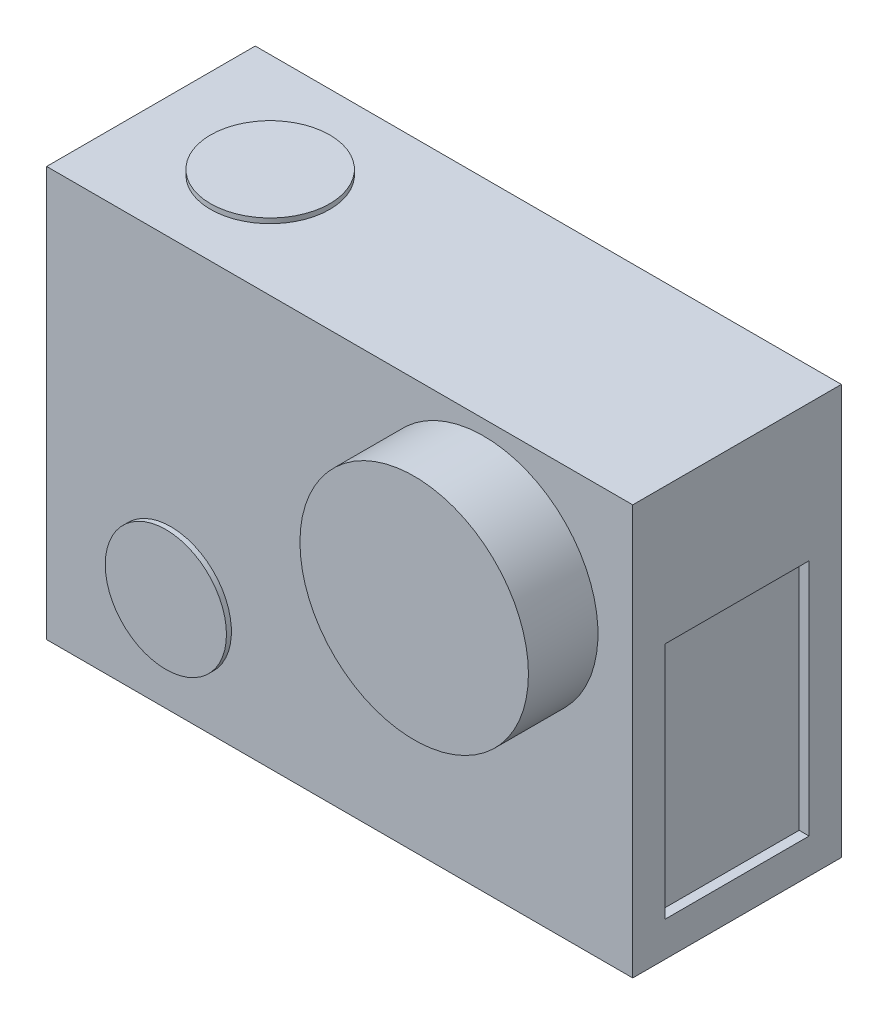
ISO-10303-21;
HEADER;
FILE_DESCRIPTION(('STEP AP214'),'2;1');
FILE_NAME('part.step','',(''),(''),'','','');
FILE_SCHEMA(('AUTOMOTIVE_DESIGN { 1 0 10303 214 1 1 1 1 }'));
ENDSEC;
DATA;
#1=APPLICATION_CONTEXT('core data for automotive mechanical design processes');
#2=APPLICATION_PROTOCOL_DEFINITION('international standard','automotive_design',2000,#1);
#3=PRODUCT_CONTEXT('',#1,'mechanical');
#4=PRODUCT('Part','Part','',(#3));
#5=PRODUCT_RELATED_PRODUCT_CATEGORY('part','',(#4));
#6=PRODUCT_DEFINITION_FORMATION('','',#4);
#7=PRODUCT_DEFINITION_CONTEXT('part definition',#1,'design');
#8=PRODUCT_DEFINITION('design','',#6,#7);
#9=PRODUCT_DEFINITION_SHAPE('','',#8);
#10=(LENGTH_UNIT() NAMED_UNIT(*) SI_UNIT(.MILLI.,.METRE.));
#11=(NAMED_UNIT(*) PLANE_ANGLE_UNIT() SI_UNIT($,.RADIAN.));
#12=(NAMED_UNIT(*) SI_UNIT($,.STERADIAN.) SOLID_ANGLE_UNIT());
#13=UNCERTAINTY_MEASURE_WITH_UNIT(LENGTH_MEASURE(1.E-05),#10,'distance_accuracy_value','');
#14=(GEOMETRIC_REPRESENTATION_CONTEXT(3) GLOBAL_UNCERTAINTY_ASSIGNED_CONTEXT((#13)) GLOBAL_UNIT_ASSIGNED_CONTEXT((#10,
#11,#12)) REPRESENTATION_CONTEXT('',''));
#15=CARTESIAN_POINT('',(0.,0.,0.));
#16=DIRECTION('',(0.,0.,1.));
#17=DIRECTION('',(1.,0.,0.));
#18=AXIS2_PLACEMENT_3D('',#15,#16,#17);
#19=CARTESIAN_POINT('',(-29.5,20.625,21.));
#20=DIRECTION('',(1.,0.,0.));
#21=DIRECTION('',(0.,0.,-1.));
#22=AXIS2_PLACEMENT_3D('',#19,#20,#21);
#23=PLANE('',#22);
#24=DIRECTION('',(0.,-1.,0.));
#25=VECTOR('',#24,1.);
#26=CARTESIAN_POINT('',(-29.5,20.625,0.));
#27=LINE('',#26,#25);
#28=CARTESIAN_POINT('',(-29.5,20.625,0.));
#29=VERTEX_POINT('',#28);
#30=CARTESIAN_POINT('',(-29.5,-20.625,0.));
#31=VERTEX_POINT('',#30);
#32=EDGE_CURVE('E196',#29,#31,#27,.T.);
#33=ORIENTED_EDGE('',*,*,#32,.T.);
#34=DIRECTION('',(0.,0.,-1.));
#35=VECTOR('',#34,1.);
#36=CARTESIAN_POINT('',(-29.5,-20.625,21.));
#37=LINE('',#36,#35);
#38=CARTESIAN_POINT('',(-29.5,-20.625,21.));
#39=VERTEX_POINT('',#38);
#40=EDGE_CURVE('E223',#39,#31,#37,.T.);
#41=ORIENTED_EDGE('',*,*,#40,.F.);
#42=DIRECTION('',(0.,-1.,0.));
#43=VECTOR('',#42,1.);
#44=CARTESIAN_POINT('',(-29.5,20.625,21.));
#45=LINE('',#44,#43);
#46=CARTESIAN_POINT('',(-29.5,20.625,21.));
#47=VERTEX_POINT('',#46);
#48=EDGE_CURVE('E197',#47,#39,#45,.T.);
#49=ORIENTED_EDGE('',*,*,#48,.F.);
#50=DIRECTION('',(0.,0.,-1.));
#51=VECTOR('',#50,1.);
#52=CARTESIAN_POINT('',(-29.5,20.625,21.));
#53=LINE('',#52,#51);
#54=EDGE_CURVE('E207',#47,#29,#53,.T.);
#55=ORIENTED_EDGE('',*,*,#54,.T.);
#56=EDGE_LOOP('',(#33,#41,#49,#55));
#57=FACE_BOUND('',#56,.T.);
#58=ADVANCED_FACE('F32',(#57),#23,.F.);
#59=CARTESIAN_POINT('',(29.5,-20.625,21.));
#60=DIRECTION('',(0.,1.,0.));
#61=DIRECTION('',(-1.,0.,0.));
#62=AXIS2_PLACEMENT_3D('',#59,#60,#61);
#63=PLANE('',#62);
#64=DIRECTION('',(1.,0.,0.));
#65=VECTOR('',#64,1.);
#66=CARTESIAN_POINT('',(29.5,-20.625,0.));
#67=LINE('',#66,#65);
#68=CARTESIAN_POINT('',(29.5,-20.625,0.));
#69=VERTEX_POINT('',#68);
#70=EDGE_CURVE('E210',#31,#69,#67,.T.);
#71=ORIENTED_EDGE('',*,*,#70,.T.);
#72=DIRECTION('',(0.,0.,-1.));
#73=VECTOR('',#72,1.);
#74=CARTESIAN_POINT('',(29.5,-20.625,21.));
#75=LINE('',#74,#73);
#76=CARTESIAN_POINT('',(29.5,-20.625,21.));
#77=VERTEX_POINT('',#76);
#78=EDGE_CURVE('E220',#77,#69,#75,.T.);
#79=ORIENTED_EDGE('',*,*,#78,.F.);
#80=DIRECTION('',(1.,0.,0.));
#81=VECTOR('',#80,1.);
#82=CARTESIAN_POINT('',(29.5,-20.625,21.));
#83=LINE('',#82,#81);
#84=EDGE_CURVE('E200',#39,#77,#83,.T.);
#85=ORIENTED_EDGE('',*,*,#84,.F.);
#86=ORIENTED_EDGE('',*,*,#40,.T.);
#87=EDGE_LOOP('',(#71,#79,#85,#86));
#88=FACE_BOUND('',#87,.T.);
#89=ADVANCED_FACE('F249',(#88),#63,.F.);
#90=CARTESIAN_POINT('',(29.5,20.625,21.));
#91=DIRECTION('',(-1.,0.,0.));
#92=DIRECTION('',(0.,-1.,0.));
#93=AXIS2_PLACEMENT_3D('',#90,#91,#92);
#94=PLANE('',#93);
#95=DIRECTION('',(0.,0.,-1.));
#96=VECTOR('',#95,1.);
#97=CARTESIAN_POINT('',(29.5,-17.125,17.75));
#98=LINE('',#97,#96);
#99=CARTESIAN_POINT('',(29.5,-17.125,17.75));
#100=VERTEX_POINT('',#99);
#101=CARTESIAN_POINT('',(29.5,-17.125,3.24999999999999));
#102=VERTEX_POINT('',#101);
#103=EDGE_CURVE('E175',#100,#102,#98,.T.);
#104=ORIENTED_EDGE('',*,*,#103,.F.);
#105=DIRECTION('',(0.,-1.,0.));
#106=VECTOR('',#105,1.);
#107=CARTESIAN_POINT('',(29.5,6.87500000000001,17.75));
#108=LINE('',#107,#106);
#109=CARTESIAN_POINT('',(29.5,6.87500000000001,17.75));
#110=VERTEX_POINT('',#109);
#111=EDGE_CURVE('E54',#110,#100,#108,.T.);
#112=ORIENTED_EDGE('',*,*,#111,.F.);
#113=DIRECTION('',(0.,0.,1.));
#114=VECTOR('',#113,1.);
#115=CARTESIAN_POINT('',(29.5,6.87500000000001,17.75));
#116=LINE('',#115,#114);
#117=CARTESIAN_POINT('',(29.5,6.87500000000001,3.25));
#118=VERTEX_POINT('',#117);
#119=EDGE_CURVE('E164',#118,#110,#116,.T.);
#120=ORIENTED_EDGE('',*,*,#119,.F.);
#121=DIRECTION('',(0.,1.,0.));
#122=VECTOR('',#121,1.);
#123=CARTESIAN_POINT('',(29.5,6.87500000000001,3.25));
#124=LINE('',#123,#122);
#125=EDGE_CURVE('E178',#102,#118,#124,.T.);
#126=ORIENTED_EDGE('',*,*,#125,.F.);
#127=EDGE_LOOP('',(#104,#112,#120,#126));
#128=FACE_BOUND('',#127,.T.);
#129=DIRECTION('',(0.,1.,0.));
#130=VECTOR('',#129,1.);
#131=CARTESIAN_POINT('',(29.5,20.625,0.));
#132=LINE('',#131,#130);
#133=CARTESIAN_POINT('',(29.5,20.625,0.));
#134=VERTEX_POINT('',#133);
#135=EDGE_CURVE('E212',#69,#134,#132,.T.);
#136=ORIENTED_EDGE('',*,*,#135,.T.);
#137=DIRECTION('',(0.,0.,-1.));
#138=VECTOR('',#137,1.);
#139=CARTESIAN_POINT('',(29.5,20.625,21.));
#140=LINE('',#139,#138);
#141=CARTESIAN_POINT('',(29.5,20.625,21.));
#142=VERTEX_POINT('',#141);
#143=EDGE_CURVE('E217',#142,#134,#140,.T.);
#144=ORIENTED_EDGE('',*,*,#143,.F.);
#145=DIRECTION('',(0.,1.,0.));
#146=VECTOR('',#145,1.);
#147=CARTESIAN_POINT('',(29.5,20.625,21.));
#148=LINE('',#147,#146);
#149=EDGE_CURVE('E203',#77,#142,#148,.T.);
#150=ORIENTED_EDGE('',*,*,#149,.F.);
#151=ORIENTED_EDGE('',*,*,#78,.T.);
#152=EDGE_LOOP('',(#136,#144,#150,#151));
#153=FACE_BOUND('',#152,.T.);
#154=ADVANCED_FACE('F254',(#128,#153),#94,.F.);
#155=CARTESIAN_POINT('',(29.5,20.625,21.));
#156=DIRECTION('',(0.,-1.,0.));
#157=DIRECTION('',(1.,0.,0.));
#158=AXIS2_PLACEMENT_3D('',#155,#156,#157);
#159=PLANE('',#158);
#160=CARTESIAN_POINT('',(-17.5,20.625,10.5));
#161=DIRECTION('',(0.,-1.,0.));
#162=DIRECTION('',(1.,0.,0.));
#163=AXIS2_PLACEMENT_3D('',#160,#161,#162);
#164=CIRCLE('',#163,6.);
#165=CARTESIAN_POINT('',(-11.5,20.625,10.5));
#166=VERTEX_POINT('',#165);
#167=EDGE_CURVE('E11',#166,#166,#164,.F.);
#168=ORIENTED_EDGE('',*,*,#167,.F.);
#169=EDGE_LOOP('',(#168));
#170=FACE_BOUND('',#169,.T.);
#171=DIRECTION('',(-1.,0.,0.));
#172=VECTOR('',#171,1.);
#173=CARTESIAN_POINT('',(29.5,20.625,0.));
#174=LINE('',#173,#172);
#175=EDGE_CURVE('E201',#134,#29,#174,.T.);
#176=ORIENTED_EDGE('',*,*,#175,.T.);
#177=ORIENTED_EDGE('',*,*,#54,.F.);
#178=DIRECTION('',(-1.,0.,0.));
#179=VECTOR('',#178,1.);
#180=CARTESIAN_POINT('',(29.5,20.625,21.));
#181=LINE('',#180,#179);
#182=EDGE_CURVE('E205',#142,#47,#181,.T.);
#183=ORIENTED_EDGE('',*,*,#182,.F.);
#184=ORIENTED_EDGE('',*,*,#143,.T.);
#185=EDGE_LOOP('',(#176,#177,#183,#184));
#186=FACE_BOUND('',#185,.T.);
#187=ADVANCED_FACE('F237',(#170,#186),#159,.F.);
#188=CARTESIAN_POINT('',(0.,0.,21.));
#189=DIRECTION('',(0.,0.,-1.));
#190=DIRECTION('',(-1.,0.,0.));
#191=AXIS2_PLACEMENT_3D('',#188,#189,#190);
#192=PLANE('',#191);
#193=CARTESIAN_POINT('',(-17.,-10.625,21.));
#194=DIRECTION('',(0.,0.,-1.));
#195=DIRECTION('',(-1.,0.,0.));
#196=AXIS2_PLACEMENT_3D('',#193,#194,#195);
#197=CIRCLE('',#196,6.1);
#198=CARTESIAN_POINT('',(-23.1,-10.625,21.));
#199=VERTEX_POINT('',#198);
#200=EDGE_CURVE('E39',#199,#199,#197,.F.);
#201=ORIENTED_EDGE('',*,*,#200,.F.);
#202=EDGE_LOOP('',(#201));
#203=FACE_BOUND('',#202,.T.);
#204=CARTESIAN_POINT('',(14.5,7.62500000000001,21.));
#205=DIRECTION('',(0.,0.,-1.));
#206=DIRECTION('',(-1.,0.,0.));
#207=AXIS2_PLACEMENT_3D('',#204,#205,#206);
#208=CIRCLE('',#207,11.5);
#209=CARTESIAN_POINT('',(2.99999999999999,7.62500000000001,21.));
#210=VERTEX_POINT('',#209);
#211=EDGE_CURVE('E226',#210,#210,#208,.F.);
#212=ORIENTED_EDGE('',*,*,#211,.F.);
#213=EDGE_LOOP('',(#212));
#214=FACE_BOUND('',#213,.T.);
#215=ORIENTED_EDGE('',*,*,#48,.T.);
#216=ORIENTED_EDGE('',*,*,#84,.T.);
#217=ORIENTED_EDGE('',*,*,#149,.T.);
#218=ORIENTED_EDGE('',*,*,#182,.T.);
#219=EDGE_LOOP('',(#215,#216,#217,#218));
#220=FACE_BOUND('',#219,.T.);
#221=ADVANCED_FACE('F233',(#203,#214,#220),#192,.F.);
#222=CARTESIAN_POINT('',(0.,0.,0.));
#223=DIRECTION('',(0.,0.,-1.));
#224=DIRECTION('',(-1.,0.,0.));
#225=AXIS2_PLACEMENT_3D('',#222,#223,#224);
#226=PLANE('',#225);
#227=DIRECTION('',(0.,-1.,0.));
#228=VECTOR('',#227,1.);
#229=CARTESIAN_POINT('',(23.5,18.25,0.));
#230=LINE('',#229,#228);
#231=CARTESIAN_POINT('',(23.5,18.25,0.));
#232=VERTEX_POINT('',#231);
#233=CARTESIAN_POINT('',(23.5,-18.25,0.));
#234=VERTEX_POINT('',#233);
#235=EDGE_CURVE('E46',#232,#234,#230,.T.);
#236=ORIENTED_EDGE('',*,*,#235,.F.);
#237=DIRECTION('',(1.,0.,0.));
#238=VECTOR('',#237,1.);
#239=CARTESIAN_POINT('',(-23.5,18.25,0.));
#240=LINE('',#239,#238);
#241=CARTESIAN_POINT('',(-23.5,18.25,0.));
#242=VERTEX_POINT('',#241);
#243=EDGE_CURVE('E140',#242,#232,#240,.T.);
#244=ORIENTED_EDGE('',*,*,#243,.F.);
#245=DIRECTION('',(0.,1.,0.));
#246=VECTOR('',#245,1.);
#247=CARTESIAN_POINT('',(-23.5,18.25,0.));
#248=LINE('',#247,#246);
#249=CARTESIAN_POINT('',(-23.5,-18.25,0.));
#250=VERTEX_POINT('',#249);
#251=EDGE_CURVE('E143',#250,#242,#248,.T.);
#252=ORIENTED_EDGE('',*,*,#251,.F.);
#253=DIRECTION('',(-1.,0.,0.));
#254=VECTOR('',#253,1.);
#255=CARTESIAN_POINT('',(-23.5,-18.25,0.));
#256=LINE('',#255,#254);
#257=EDGE_CURVE('E151',#234,#250,#256,.T.);
#258=ORIENTED_EDGE('',*,*,#257,.F.);
#259=EDGE_LOOP('',(#236,#244,#252,#258));
#260=FACE_BOUND('',#259,.T.);
#261=ORIENTED_EDGE('',*,*,#32,.F.);
#262=ORIENTED_EDGE('',*,*,#175,.F.);
#263=ORIENTED_EDGE('',*,*,#135,.F.);
#264=ORIENTED_EDGE('',*,*,#70,.F.);
#265=EDGE_LOOP('',(#261,#262,#263,#264));
#266=FACE_BOUND('',#265,.T.);
#267=ADVANCED_FACE('F236',(#260,#266),#226,.T.);
#268=CARTESIAN_POINT('',(14.5,7.62500000000001,28.));
#269=DIRECTION('',(0.,0.,-1.));
#270=DIRECTION('',(-1.,0.,0.));
#271=AXIS2_PLACEMENT_3D('',#268,#269,#270);
#272=CYLINDRICAL_SURFACE('',#271,11.5);
#273=CARTESIAN_POINT('',(14.5,7.62500000000001,28.));
#274=DIRECTION('',(0.,0.,1.));
#275=DIRECTION('',(1.,0.,0.));
#276=AXIS2_PLACEMENT_3D('',#273,#274,#275);
#277=CIRCLE('',#276,11.5);
#278=CARTESIAN_POINT('',(26.,7.62500000000001,28.));
#279=VERTEX_POINT('',#278);
#280=EDGE_CURVE('E193',#279,#279,#277,.T.);
#281=ORIENTED_EDGE('',*,*,#280,.F.);
#282=EDGE_LOOP('',(#281));
#283=FACE_BOUND('',#282,.T.);
#284=ORIENTED_EDGE('',*,*,#211,.T.);
#285=EDGE_LOOP('',(#284));
#286=FACE_BOUND('',#285,.T.);
#287=ADVANCED_FACE('F259',(#283,#286),#272,.T.);
#288=CARTESIAN_POINT('',(14.5,7.62500000000001,28.));
#289=DIRECTION('',(0.,0.,1.));
#290=DIRECTION('',(1.,0.,0.));
#291=AXIS2_PLACEMENT_3D('',#288,#289,#290);
#292=PLANE('',#291);
#293=ORIENTED_EDGE('',*,*,#280,.T.);
#294=EDGE_LOOP('',(#293));
#295=FACE_BOUND('',#294,.T.);
#296=ADVANCED_FACE('F265',(#295),#292,.T.);
#297=CARTESIAN_POINT('',(-17.,-10.625,21.5));
#298=DIRECTION('',(0.,0.,-1.));
#299=DIRECTION('',(-1.,0.,0.));
#300=AXIS2_PLACEMENT_3D('',#297,#298,#299);
#301=CYLINDRICAL_SURFACE('',#300,6.1);
#302=CARTESIAN_POINT('',(-17.,-10.625,21.5));
#303=DIRECTION('',(0.,0.,1.));
#304=DIRECTION('',(1.,0.,0.));
#305=AXIS2_PLACEMENT_3D('',#302,#303,#304);
#306=CIRCLE('',#305,6.1);
#307=CARTESIAN_POINT('',(-10.9,-10.625,21.5));
#308=VERTEX_POINT('',#307);
#309=EDGE_CURVE('E185',#308,#308,#306,.T.);
#310=ORIENTED_EDGE('',*,*,#309,.F.);
#311=EDGE_LOOP('',(#310));
#312=FACE_BOUND('',#311,.T.);
#313=ORIENTED_EDGE('',*,*,#200,.T.);
#314=EDGE_LOOP('',(#313));
#315=FACE_BOUND('',#314,.T.);
#316=ADVANCED_FACE('F231',(#312,#315),#301,.T.);
#317=CARTESIAN_POINT('',(-17.,-10.625,21.5));
#318=DIRECTION('',(0.,0.,1.));
#319=DIRECTION('',(1.,0.,0.));
#320=AXIS2_PLACEMENT_3D('',#317,#318,#319);
#321=PLANE('',#320);
#322=ORIENTED_EDGE('',*,*,#309,.T.);
#323=EDGE_LOOP('',(#322));
#324=FACE_BOUND('',#323,.T.);
#325=ADVANCED_FACE('F329',(#324),#321,.T.);
#326=CARTESIAN_POINT('',(28.5,6.87500000000001,17.75));
#327=DIRECTION('',(0.,0.,1.));
#328=DIRECTION('',(0.,-1.,0.));
#329=AXIS2_PLACEMENT_3D('',#326,#327,#328);
#330=PLANE('',#329);
#331=ORIENTED_EDGE('',*,*,#111,.T.);
#332=DIRECTION('',(1.,0.,0.));
#333=VECTOR('',#332,1.);
#334=CARTESIAN_POINT('',(28.5,-17.125,17.75));
#335=LINE('',#334,#333);
#336=CARTESIAN_POINT('',(28.5,-17.125,17.75));
#337=VERTEX_POINT('',#336);
#338=EDGE_CURVE('E173',#337,#100,#335,.T.);
#339=ORIENTED_EDGE('',*,*,#338,.F.);
#340=DIRECTION('',(0.,-1.,0.));
#341=VECTOR('',#340,1.);
#342=CARTESIAN_POINT('',(28.5,6.87500000000001,17.75));
#343=LINE('',#342,#341);
#344=CARTESIAN_POINT('',(28.5,6.87500000000001,17.75));
#345=VERTEX_POINT('',#344);
#346=EDGE_CURVE('E160',#345,#337,#343,.T.);
#347=ORIENTED_EDGE('',*,*,#346,.F.);
#348=DIRECTION('',(1.,0.,0.));
#349=VECTOR('',#348,1.);
#350=CARTESIAN_POINT('',(28.5,6.87500000000001,17.75));
#351=LINE('',#350,#349);
#352=EDGE_CURVE('E183',#345,#110,#351,.T.);
#353=ORIENTED_EDGE('',*,*,#352,.T.);
#354=EDGE_LOOP('',(#331,#339,#347,#353));
#355=FACE_BOUND('',#354,.T.);
#356=ADVANCED_FACE('F319',(#355),#330,.F.);
#357=CARTESIAN_POINT('',(28.5,6.87500000000001,17.75));
#358=DIRECTION('',(0.,1.,0.));
#359=DIRECTION('',(0.,0.,1.));
#360=AXIS2_PLACEMENT_3D('',#357,#358,#359);
#361=PLANE('',#360);
#362=ORIENTED_EDGE('',*,*,#119,.T.);
#363=ORIENTED_EDGE('',*,*,#352,.F.);
#364=DIRECTION('',(0.,0.,1.));
#365=VECTOR('',#364,1.);
#366=CARTESIAN_POINT('',(28.5,6.87500000000001,17.75));
#367=LINE('',#366,#365);
#368=CARTESIAN_POINT('',(28.5,6.87500000000001,3.25));
#369=VERTEX_POINT('',#368);
#370=EDGE_CURVE('E170',#369,#345,#367,.T.);
#371=ORIENTED_EDGE('',*,*,#370,.F.);
#372=DIRECTION('',(1.,0.,0.));
#373=VECTOR('',#372,1.);
#374=CARTESIAN_POINT('',(28.5,6.87500000000001,3.25));
#375=LINE('',#374,#373);
#376=EDGE_CURVE('E186',#369,#118,#375,.T.);
#377=ORIENTED_EDGE('',*,*,#376,.T.);
#378=EDGE_LOOP('',(#362,#363,#371,#377));
#379=FACE_BOUND('',#378,.T.);
#380=ADVANCED_FACE('F315',(#379),#361,.F.);
#381=CARTESIAN_POINT('',(28.5,6.87500000000001,3.25));
#382=DIRECTION('',(0.,0.,-1.));
#383=DIRECTION('',(0.,1.,0.));
#384=AXIS2_PLACEMENT_3D('',#381,#382,#383);
#385=PLANE('',#384);
#386=ORIENTED_EDGE('',*,*,#125,.T.);
#387=ORIENTED_EDGE('',*,*,#376,.F.);
#388=DIRECTION('',(0.,1.,0.));
#389=VECTOR('',#388,1.);
#390=CARTESIAN_POINT('',(28.5,6.87500000000001,3.25));
#391=LINE('',#390,#389);
#392=CARTESIAN_POINT('',(28.5,-17.125,3.24999999999999));
#393=VERTEX_POINT('',#392);
#394=EDGE_CURVE('E167',#393,#369,#391,.T.);
#395=ORIENTED_EDGE('',*,*,#394,.F.);
#396=DIRECTION('',(1.,0.,0.));
#397=VECTOR('',#396,1.);
#398=CARTESIAN_POINT('',(28.5,-17.125,3.24999999999999));
#399=LINE('',#398,#397);
#400=EDGE_CURVE('E188',#393,#102,#399,.T.);
#401=ORIENTED_EDGE('',*,*,#400,.T.);
#402=EDGE_LOOP('',(#386,#387,#395,#401));
#403=FACE_BOUND('',#402,.T.);
#404=ADVANCED_FACE('F318',(#403),#385,.F.);
#405=CARTESIAN_POINT('',(28.5,-17.125,17.75));
#406=DIRECTION('',(0.,-1.,0.));
#407=DIRECTION('',(0.,0.,-1.));
#408=AXIS2_PLACEMENT_3D('',#405,#406,#407);
#409=PLANE('',#408);
#410=ORIENTED_EDGE('',*,*,#103,.T.);
#411=ORIENTED_EDGE('',*,*,#400,.F.);
#412=DIRECTION('',(0.,0.,-1.));
#413=VECTOR('',#412,1.);
#414=CARTESIAN_POINT('',(28.5,-17.125,17.75));
#415=LINE('',#414,#413);
#416=EDGE_CURVE('E163',#337,#393,#415,.T.);
#417=ORIENTED_EDGE('',*,*,#416,.F.);
#418=ORIENTED_EDGE('',*,*,#338,.T.);
#419=EDGE_LOOP('',(#410,#411,#417,#418));
#420=FACE_BOUND('',#419,.T.);
#421=ADVANCED_FACE('F313',(#420),#409,.F.);
#422=CARTESIAN_POINT('',(28.5,0.,0.));
#423=DIRECTION('',(1.,0.,0.));
#424=DIRECTION('',(0.,0.,-1.));
#425=AXIS2_PLACEMENT_3D('',#422,#423,#424);
#426=PLANE('',#425);
#427=ORIENTED_EDGE('',*,*,#346,.T.);
#428=ORIENTED_EDGE('',*,*,#416,.T.);
#429=ORIENTED_EDGE('',*,*,#394,.T.);
#430=ORIENTED_EDGE('',*,*,#370,.T.);
#431=EDGE_LOOP('',(#427,#428,#429,#430));
#432=FACE_BOUND('',#431,.T.);
#433=ADVANCED_FACE('F310',(#432),#426,.T.);
#434=CARTESIAN_POINT('',(23.5,18.25,0.2));
#435=DIRECTION('',(1.,0.,0.));
#436=DIRECTION('',(0.,1.,0.));
#437=AXIS2_PLACEMENT_3D('',#434,#435,#436);
#438=PLANE('',#437);
#439=ORIENTED_EDGE('',*,*,#235,.T.);
#440=DIRECTION('',(0.,0.,-1.));
#441=VECTOR('',#440,1.);
#442=CARTESIAN_POINT('',(23.5,-18.25,0.2));
#443=LINE('',#442,#441);
#444=CARTESIAN_POINT('',(23.5,-18.25,0.2));
#445=VERTEX_POINT('',#444);
#446=EDGE_CURVE('E118',#445,#234,#443,.T.);
#447=ORIENTED_EDGE('',*,*,#446,.F.);
#448=DIRECTION('',(0.,-1.,0.));
#449=VECTOR('',#448,1.);
#450=CARTESIAN_POINT('',(23.5,18.25,0.2));
#451=LINE('',#450,#449);
#452=CARTESIAN_POINT('',(23.5,18.25,0.2));
#453=VERTEX_POINT('',#452);
#454=EDGE_CURVE('E122',#453,#445,#451,.T.);
#455=ORIENTED_EDGE('',*,*,#454,.F.);
#456=DIRECTION('',(0.,0.,-1.));
#457=VECTOR('',#456,1.);
#458=CARTESIAN_POINT('',(23.5,18.25,0.2));
#459=LINE('',#458,#457);
#460=EDGE_CURVE('E155',#453,#232,#459,.T.);
#461=ORIENTED_EDGE('',*,*,#460,.T.);
#462=EDGE_LOOP('',(#439,#447,#455,#461));
#463=FACE_BOUND('',#462,.T.);
#464=ADVANCED_FACE('F120',(#463),#438,.F.);
#465=CARTESIAN_POINT('',(-23.5,18.25,0.2));
#466=DIRECTION('',(0.,1.,0.));
#467=DIRECTION('',(-1.,0.,0.));
#468=AXIS2_PLACEMENT_3D('',#465,#466,#467);
#469=PLANE('',#468);
#470=ORIENTED_EDGE('',*,*,#243,.T.);
#471=ORIENTED_EDGE('',*,*,#460,.F.);
#472=DIRECTION('',(1.,0.,0.));
#473=VECTOR('',#472,1.);
#474=CARTESIAN_POINT('',(-23.5,18.25,0.2));
#475=LINE('',#474,#473);
#476=CARTESIAN_POINT('',(-23.5,18.25,0.2));
#477=VERTEX_POINT('',#476);
#478=EDGE_CURVE('E128',#477,#453,#475,.T.);
#479=ORIENTED_EDGE('',*,*,#478,.F.);
#480=DIRECTION('',(0.,0.,-1.));
#481=VECTOR('',#480,1.);
#482=CARTESIAN_POINT('',(-23.5,18.25,0.2));
#483=LINE('',#482,#481);
#484=EDGE_CURVE('E157',#477,#242,#483,.T.);
#485=ORIENTED_EDGE('',*,*,#484,.T.);
#486=EDGE_LOOP('',(#470,#471,#479,#485));
#487=FACE_BOUND('',#486,.T.);
#488=ADVANCED_FACE('F298',(#487),#469,.F.);
#489=CARTESIAN_POINT('',(-23.5,18.25,0.2));
#490=DIRECTION('',(-1.,0.,0.));
#491=DIRECTION('',(0.,-1.,0.));
#492=AXIS2_PLACEMENT_3D('',#489,#490,#491);
#493=PLANE('',#492);
#494=ORIENTED_EDGE('',*,*,#251,.T.);
#495=ORIENTED_EDGE('',*,*,#484,.F.);
#496=DIRECTION('',(0.,1.,0.));
#497=VECTOR('',#496,1.);
#498=CARTESIAN_POINT('',(-23.5,18.25,0.2));
#499=LINE('',#498,#497);
#500=CARTESIAN_POINT('',(-23.5,-18.25,0.2));
#501=VERTEX_POINT('',#500);
#502=EDGE_CURVE('E136',#501,#477,#499,.T.);
#503=ORIENTED_EDGE('',*,*,#502,.F.);
#504=DIRECTION('',(0.,0.,-1.));
#505=VECTOR('',#504,1.);
#506=CARTESIAN_POINT('',(-23.5,-18.25,0.2));
#507=LINE('',#506,#505);
#508=EDGE_CURVE('E127',#501,#250,#507,.T.);
#509=ORIENTED_EDGE('',*,*,#508,.T.);
#510=EDGE_LOOP('',(#494,#495,#503,#509));
#511=FACE_BOUND('',#510,.T.);
#512=ADVANCED_FACE('F301',(#511),#493,.F.);
#513=CARTESIAN_POINT('',(-23.5,-18.25,0.2));
#514=DIRECTION('',(0.,-1.,0.));
#515=DIRECTION('',(1.,0.,0.));
#516=AXIS2_PLACEMENT_3D('',#513,#514,#515);
#517=PLANE('',#516);
#518=ORIENTED_EDGE('',*,*,#257,.T.);
#519=ORIENTED_EDGE('',*,*,#508,.F.);
#520=DIRECTION('',(-1.,0.,0.));
#521=VECTOR('',#520,1.);
#522=CARTESIAN_POINT('',(-23.5,-18.25,0.2));
#523=LINE('',#522,#521);
#524=EDGE_CURVE('E131',#445,#501,#523,.T.);
#525=ORIENTED_EDGE('',*,*,#524,.F.);
#526=ORIENTED_EDGE('',*,*,#446,.T.);
#527=EDGE_LOOP('',(#518,#519,#525,#526));
#528=FACE_BOUND('',#527,.T.);
#529=ADVANCED_FACE('F132',(#528),#517,.F.);
#530=CARTESIAN_POINT('',(0.,0.,0.2));
#531=DIRECTION('',(0.,0.,1.));
#532=DIRECTION('',(1.,0.,0.));
#533=AXIS2_PLACEMENT_3D('',#530,#531,#532);
#534=PLANE('',#533);
#535=ORIENTED_EDGE('',*,*,#454,.T.);
#536=ORIENTED_EDGE('',*,*,#524,.T.);
#537=ORIENTED_EDGE('',*,*,#502,.T.);
#538=ORIENTED_EDGE('',*,*,#478,.T.);
#539=EDGE_LOOP('',(#535,#536,#537,#538));
#540=FACE_BOUND('',#539,.T.);
#541=ADVANCED_FACE('F138',(#540),#534,.F.);
#542=CARTESIAN_POINT('',(-17.5,21.125,10.5));
#543=DIRECTION('',(0.,-1.,0.));
#544=DIRECTION('',(1.,0.,0.));
#545=AXIS2_PLACEMENT_3D('',#542,#543,#544);
#546=CYLINDRICAL_SURFACE('',#545,6.);
#547=CARTESIAN_POINT('',(-17.5,21.125,10.5));
#548=DIRECTION('',(0.,1.,0.));
#549=DIRECTION('',(-1.,0.,0.));
#550=AXIS2_PLACEMENT_3D('',#547,#548,#549);
#551=CIRCLE('',#550,6.);
#552=CARTESIAN_POINT('',(-23.5,21.125,10.5));
#553=VERTEX_POINT('',#552);
#554=EDGE_CURVE('E146',#553,#553,#551,.T.);
#555=ORIENTED_EDGE('',*,*,#554,.F.);
#556=EDGE_LOOP('',(#555));
#557=FACE_BOUND('',#556,.T.);
#558=ORIENTED_EDGE('',*,*,#167,.T.);
#559=EDGE_LOOP('',(#558));
#560=FACE_BOUND('',#559,.T.);
#561=ADVANCED_FACE('F284',(#557,#560),#546,.T.);
#562=CARTESIAN_POINT('',(-17.5,21.125,10.5));
#563=DIRECTION('',(0.,1.,0.));
#564=DIRECTION('',(-1.,0.,0.));
#565=AXIS2_PLACEMENT_3D('',#562,#563,#564);
#566=PLANE('',#565);
#567=ORIENTED_EDGE('',*,*,#554,.T.);
#568=EDGE_LOOP('',(#567));
#569=FACE_BOUND('',#568,.T.);
#570=ADVANCED_FACE('F286',(#569),#566,.T.);
#571=CLOSED_SHELL('',(#58,#89,#154,#187,#221,#267,#287,#296,#316,#325,#356,#380,#404,#421,#433,
#464,#488,#512,#529,#541,#561,#570));
#572=MANIFOLD_SOLID_BREP('B2',#571);
#573=ADVANCED_BREP_SHAPE_REPRESENTATION('',(#18,#572),#14);
#574=SHAPE_DEFINITION_REPRESENTATION(#9,#573);
ENDSEC;
END-ISO-10303-21;
